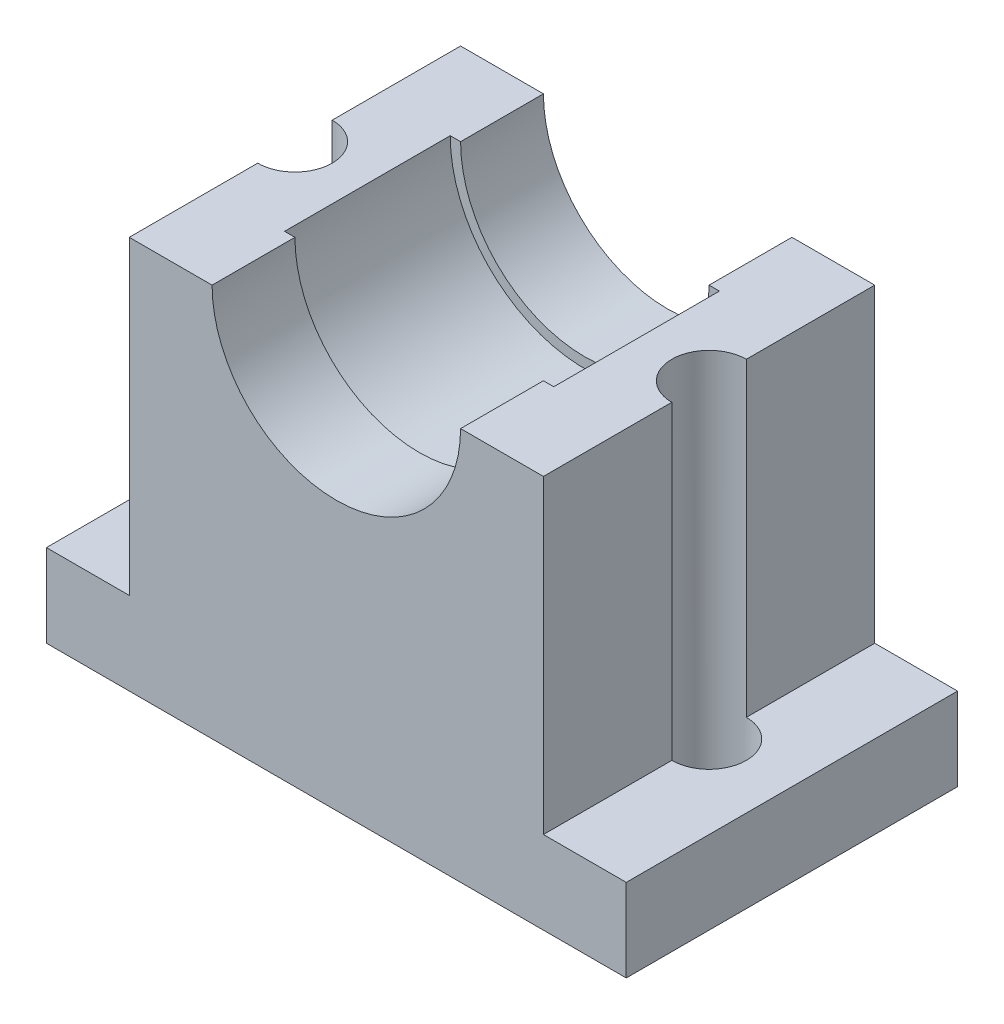
ISO-10303-21;
HEADER;
FILE_DESCRIPTION(('STEP AP214'),'2;1');
FILE_NAME('part.step','',(''),(''),'','','');
FILE_SCHEMA(('AUTOMOTIVE_DESIGN { 1 0 10303 214 1 1 1 1 }'));
ENDSEC;
DATA;
#1=APPLICATION_CONTEXT('core data for automotive mechanical design processes');
#2=APPLICATION_PROTOCOL_DEFINITION('international standard','automotive_design',2000,#1);
#3=PRODUCT_CONTEXT('',#1,'mechanical');
#4=PRODUCT('Part','Part','',(#3));
#5=PRODUCT_RELATED_PRODUCT_CATEGORY('part','',(#4));
#6=PRODUCT_DEFINITION_FORMATION('','',#4);
#7=PRODUCT_DEFINITION_CONTEXT('part definition',#1,'design');
#8=PRODUCT_DEFINITION('design','',#6,#7);
#9=PRODUCT_DEFINITION_SHAPE('','',#8);
#10=(LENGTH_UNIT() NAMED_UNIT(*) SI_UNIT(.MILLI.,.METRE.));
#11=(NAMED_UNIT(*) PLANE_ANGLE_UNIT() SI_UNIT($,.RADIAN.));
#12=(NAMED_UNIT(*) SI_UNIT($,.STERADIAN.) SOLID_ANGLE_UNIT());
#13=UNCERTAINTY_MEASURE_WITH_UNIT(LENGTH_MEASURE(1.E-05),#10,'distance_accuracy_value','');
#14=(GEOMETRIC_REPRESENTATION_CONTEXT(3) GLOBAL_UNCERTAINTY_ASSIGNED_CONTEXT((#13)) GLOBAL_UNIT_ASSIGNED_CONTEXT((#10,
#11,#12)) REPRESENTATION_CONTEXT('',''));
#15=CARTESIAN_POINT('',(0.,0.,0.));
#16=DIRECTION('',(0.,0.,1.));
#17=DIRECTION('',(1.,0.,0.));
#18=AXIS2_PLACEMENT_3D('',#15,#16,#17);
#19=CARTESIAN_POINT('',(-50.,20.,-40.));
#20=DIRECTION('',(-1.,0.,0.));
#21=DIRECTION('',(0.,0.,1.));
#22=AXIS2_PLACEMENT_3D('',#19,#20,#21);
#23=PLANE('',#22);
#24=DIRECTION('',(0.,0.,1.));
#25=VECTOR('',#24,1.);
#26=CARTESIAN_POINT('',(-50.,94.8836690389627,-40.));
#27=LINE('',#26,#25);
#28=CARTESIAN_POINT('',(-50.,94.8836690389627,9.));
#29=VERTEX_POINT('',#28);
#30=CARTESIAN_POINT('',(-50.,94.8836690389627,40.));
#31=VERTEX_POINT('',#30);
#32=EDGE_CURVE('E171',#29,#31,#27,.T.);
#33=ORIENTED_EDGE('',*,*,#32,.F.);
#34=DIRECTION('',(0.,1.,0.));
#35=VECTOR('',#34,1.);
#36=CARTESIAN_POINT('',(-50.,0.,8.99999999999999));
#37=LINE('',#36,#35);
#38=CARTESIAN_POINT('',(-50.,20.,9.));
#39=VERTEX_POINT('',#38);
#40=EDGE_CURVE('E11',#29,#39,#37,.F.);
#41=ORIENTED_EDGE('',*,*,#40,.T.);
#42=DIRECTION('',(0.,0.,1.));
#43=VECTOR('',#42,1.);
#44=CARTESIAN_POINT('',(-50.,20.,-40.));
#45=LINE('',#44,#43);
#46=CARTESIAN_POINT('',(-50.,20.,40.));
#47=VERTEX_POINT('',#46);
#48=EDGE_CURVE('E205',#39,#47,#45,.T.);
#49=ORIENTED_EDGE('',*,*,#48,.T.);
#50=DIRECTION('',(0.,-1.,0.));
#51=VECTOR('',#50,1.);
#52=CARTESIAN_POINT('',(-50.,20.,40.));
#53=LINE('',#52,#51);
#54=EDGE_CURVE('E178',#31,#47,#53,.T.);
#55=ORIENTED_EDGE('',*,*,#54,.F.);
#56=EDGE_LOOP('',(#33,#41,#49,#55));
#57=FACE_BOUND('',#56,.T.);
#58=ADVANCED_FACE('F39',(#57),#23,.T.);
#59=CARTESIAN_POINT('',(-50.,20.,-40.));
#60=VERTEX_POINT('',#59);
#61=CARTESIAN_POINT('',(-50.,20.,-9.00000000000001));
#62=VERTEX_POINT('',#61);
#63=EDGE_CURVE('E202',#60,#62,#45,.T.);
#64=ORIENTED_EDGE('',*,*,#63,.T.);
#65=DIRECTION('',(0.,1.,0.));
#66=VECTOR('',#65,1.);
#67=CARTESIAN_POINT('',(-50.,0.,-9.00000000000001));
#68=LINE('',#67,#66);
#69=CARTESIAN_POINT('',(-50.,94.8836690389627,-9.00000000000001));
#70=VERTEX_POINT('',#69);
#71=EDGE_CURVE('E47',#62,#70,#68,.T.);
#72=ORIENTED_EDGE('',*,*,#71,.T.);
#73=CARTESIAN_POINT('',(-50.,94.8836690389627,-40.));
#74=VERTEX_POINT('',#73);
#75=EDGE_CURVE('E174',#74,#70,#27,.T.);
#76=ORIENTED_EDGE('',*,*,#75,.F.);
#77=DIRECTION('',(0.,-1.,0.));
#78=VECTOR('',#77,1.);
#79=CARTESIAN_POINT('',(-50.,20.,-40.));
#80=LINE('',#79,#78);
#81=EDGE_CURVE('E289',#74,#60,#80,.T.);
#82=ORIENTED_EDGE('',*,*,#81,.T.);
#83=EDGE_LOOP('',(#64,#72,#76,#82));
#84=FACE_BOUND('',#83,.T.);
#85=ADVANCED_FACE('F252',(#84),#23,.T.);
#86=CARTESIAN_POINT('',(50.,20.,-40.));
#87=DIRECTION('',(1.,0.,0.));
#88=DIRECTION('',(0.,0.,-1.));
#89=AXIS2_PLACEMENT_3D('',#86,#87,#88);
#90=PLANE('',#89);
#91=DIRECTION('',(0.,1.,0.));
#92=VECTOR('',#91,1.);
#93=CARTESIAN_POINT('',(50.,0.,-9.00000000000001));
#94=LINE('',#93,#92);
#95=CARTESIAN_POINT('',(50.,20.,-9.00000000000001));
#96=VERTEX_POINT('',#95);
#97=CARTESIAN_POINT('',(50.,94.8836690389627,-9.00000000000001));
#98=VERTEX_POINT('',#97);
#99=EDGE_CURVE('E250',#96,#98,#94,.T.);
#100=ORIENTED_EDGE('',*,*,#99,.F.);
#101=DIRECTION('',(0.,0.,1.));
#102=VECTOR('',#101,1.);
#103=CARTESIAN_POINT('',(50.,20.,-40.));
#104=LINE('',#103,#102);
#105=CARTESIAN_POINT('',(50.,20.,-40.));
#106=VERTEX_POINT('',#105);
#107=EDGE_CURVE('E198',#106,#96,#104,.T.);
#108=ORIENTED_EDGE('',*,*,#107,.F.);
#109=DIRECTION('',(0.,1.,0.));
#110=VECTOR('',#109,1.);
#111=CARTESIAN_POINT('',(50.,20.,-40.));
#112=LINE('',#111,#110);
#113=CARTESIAN_POINT('',(50.,94.8836690389627,-40.));
#114=VERTEX_POINT('',#113);
#115=EDGE_CURVE('E291',#106,#114,#112,.T.);
#116=ORIENTED_EDGE('',*,*,#115,.T.);
#117=DIRECTION('',(0.,0.,1.));
#118=VECTOR('',#117,1.);
#119=CARTESIAN_POINT('',(50.,94.8836690389627,-40.));
#120=LINE('',#119,#118);
#121=EDGE_CURVE('E194',#114,#98,#120,.T.);
#122=ORIENTED_EDGE('',*,*,#121,.T.);
#123=EDGE_LOOP('',(#100,#108,#116,#122));
#124=FACE_BOUND('',#123,.T.);
#125=ADVANCED_FACE('F361',(#124),#90,.T.);
#126=CARTESIAN_POINT('',(-50.,94.8836690389627,-40.));
#127=DIRECTION('',(0.,1.,0.));
#128=DIRECTION('',(0.,0.,1.));
#129=AXIS2_PLACEMENT_3D('',#126,#127,#128);
#130=PLANE('',#129);
#131=ORIENTED_EDGE('',*,*,#75,.T.);
#132=CARTESIAN_POINT('',(-50.,94.8836690389627,0.));
#133=DIRECTION('',(0.,-1.,0.));
#134=DIRECTION('',(0.,0.,1.));
#135=AXIS2_PLACEMENT_3D('',#132,#133,#134);
#136=CIRCLE('',#135,9.);
#137=EDGE_CURVE('E54',#70,#29,#136,.T.);
#138=ORIENTED_EDGE('',*,*,#137,.T.);
#139=ORIENTED_EDGE('',*,*,#32,.T.);
#140=DIRECTION('',(-1.,0.,0.));
#141=VECTOR('',#140,1.);
#142=CARTESIAN_POINT('',(-50.,94.8836690389627,40.));
#143=LINE('',#142,#141);
#144=CARTESIAN_POINT('',(-30.,94.8836690389627,40.));
#145=VERTEX_POINT('',#144);
#146=EDGE_CURVE('E187',#145,#31,#143,.T.);
#147=ORIENTED_EDGE('',*,*,#146,.F.);
#148=DIRECTION('',(0.,0.,1.));
#149=VECTOR('',#148,1.);
#150=CARTESIAN_POINT('',(-30.,94.8836690389627,-40.));
#151=LINE('',#150,#149);
#152=CARTESIAN_POINT('',(-30.,94.8836690389627,20.));
#153=VERTEX_POINT('',#152);
#154=EDGE_CURVE('E184',#153,#145,#151,.T.);
#155=ORIENTED_EDGE('',*,*,#154,.F.);
#156=DIRECTION('',(-1.,0.,0.));
#157=VECTOR('',#156,1.);
#158=CARTESIAN_POINT('',(-50.,94.8836690389627,20.));
#159=LINE('',#158,#157);
#160=CARTESIAN_POINT('',(-32.5,94.8836690389627,20.));
#161=VERTEX_POINT('',#160);
#162=EDGE_CURVE('E280',#153,#161,#159,.T.);
#163=ORIENTED_EDGE('',*,*,#162,.T.);
#164=DIRECTION('',(0.,0.,1.));
#165=VECTOR('',#164,1.);
#166=CARTESIAN_POINT('',(-32.5,94.8836690389627,29.5759877610635));
#167=LINE('',#166,#165);
#168=CARTESIAN_POINT('',(-32.5,94.8836690389627,-20.));
#169=VERTEX_POINT('',#168);
#170=EDGE_CURVE('E283',#161,#169,#167,.F.);
#171=ORIENTED_EDGE('',*,*,#170,.T.);
#172=DIRECTION('',(1.,0.,0.));
#173=VECTOR('',#172,1.);
#174=CARTESIAN_POINT('',(-50.,94.8836690389627,-20.));
#175=LINE('',#174,#173);
#176=CARTESIAN_POINT('',(-30.,94.8836690389627,-20.));
#177=VERTEX_POINT('',#176);
#178=EDGE_CURVE('E286',#169,#177,#175,.T.);
#179=ORIENTED_EDGE('',*,*,#178,.T.);
#180=CARTESIAN_POINT('',(-30.,94.8836690389627,-40.));
#181=VERTEX_POINT('',#180);
#182=EDGE_CURVE('E180',#181,#177,#151,.T.);
#183=ORIENTED_EDGE('',*,*,#182,.F.);
#184=DIRECTION('',(-1.,0.,0.));
#185=VECTOR('',#184,1.);
#186=CARTESIAN_POINT('',(-50.,94.8836690389627,-40.));
#187=LINE('',#186,#185);
#188=EDGE_CURVE('E300',#181,#74,#187,.T.);
#189=ORIENTED_EDGE('',*,*,#188,.T.);
#190=EDGE_LOOP('',(#131,#138,#139,#147,#155,#163,#171,#179,#183,#189));
#191=FACE_BOUND('',#190,.T.);
#192=ADVANCED_FACE('F169',(#191),#130,.T.);
#193=CARTESIAN_POINT('',(0.,94.8836690389627,-40.));
#194=DIRECTION('',(0.,0.,1.));
#195=DIRECTION('',(1.,0.,0.));
#196=AXIS2_PLACEMENT_3D('',#193,#194,#195);
#197=CYLINDRICAL_SURFACE('',#196,30.);
#198=ORIENTED_EDGE('',*,*,#182,.T.);
#199=CARTESIAN_POINT('',(0.,94.8836690389627,-20.));
#200=DIRECTION('',(0.,0.,1.));
#201=DIRECTION('',(1.,0.,0.));
#202=AXIS2_PLACEMENT_3D('',#199,#200,#201);
#203=CIRCLE('',#202,30.);
#204=CARTESIAN_POINT('',(30.,94.8836690389627,-20.));
#205=VERTEX_POINT('',#204);
#206=EDGE_CURVE('E277',#177,#205,#203,.T.);
#207=ORIENTED_EDGE('',*,*,#206,.T.);
#208=DIRECTION('',(0.,0.,1.));
#209=VECTOR('',#208,1.);
#210=CARTESIAN_POINT('',(30.,94.8836690389627,-40.));
#211=LINE('',#210,#209);
#212=CARTESIAN_POINT('',(30.,94.8836690389627,-40.));
#213=VERTEX_POINT('',#212);
#214=EDGE_CURVE('E190',#213,#205,#211,.T.);
#215=ORIENTED_EDGE('',*,*,#214,.F.);
#216=CARTESIAN_POINT('',(0.,94.8836690389627,-40.));
#217=DIRECTION('',(0.,0.,-1.));
#218=DIRECTION('',(1.,0.,0.));
#219=AXIS2_PLACEMENT_3D('',#216,#217,#218);
#220=CIRCLE('',#219,30.);
#221=EDGE_CURVE('E297',#213,#181,#220,.T.);
#222=ORIENTED_EDGE('',*,*,#221,.T.);
#223=EDGE_LOOP('',(#198,#207,#215,#222));
#224=FACE_BOUND('',#223,.T.);
#225=ADVANCED_FACE('F331',(#224),#197,.F.);
#226=CARTESIAN_POINT('',(30.,94.8836690389627,20.));
#227=VERTEX_POINT('',#226);
#228=CARTESIAN_POINT('',(30.,94.8836690389627,40.));
#229=VERTEX_POINT('',#228);
#230=EDGE_CURVE('E193',#227,#229,#211,.T.);
#231=ORIENTED_EDGE('',*,*,#230,.F.);
#232=CARTESIAN_POINT('',(0.,94.8836690389627,20.));
#233=DIRECTION('',(0.,0.,1.));
#234=DIRECTION('',(1.,0.,0.));
#235=AXIS2_PLACEMENT_3D('',#232,#233,#234);
#236=CIRCLE('',#235,30.);
#237=EDGE_CURVE('E269',#153,#227,#236,.T.);
#238=ORIENTED_EDGE('',*,*,#237,.F.);
#239=ORIENTED_EDGE('',*,*,#154,.T.);
#240=CARTESIAN_POINT('',(0.,94.8836690389627,40.));
#241=DIRECTION('',(0.,0.,-1.));
#242=DIRECTION('',(1.,0.,0.));
#243=AXIS2_PLACEMENT_3D('',#240,#241,#242);
#244=CIRCLE('',#243,30.);
#245=EDGE_CURVE('E308',#229,#145,#244,.T.);
#246=ORIENTED_EDGE('',*,*,#245,.F.);
#247=EDGE_LOOP('',(#231,#238,#239,#246));
#248=FACE_BOUND('',#247,.T.);
#249=ADVANCED_FACE('F318',(#248),#197,.F.);
#250=CARTESIAN_POINT('',(30.,94.8836690389627,-40.));
#251=DIRECTION('',(0.,1.,0.));
#252=DIRECTION('',(0.,0.,1.));
#253=AXIS2_PLACEMENT_3D('',#250,#251,#252);
#254=PLANE('',#253);
#255=CARTESIAN_POINT('',(50.,94.8836690389627,0.));
#256=DIRECTION('',(0.,1.,0.));
#257=DIRECTION('',(0.,0.,1.));
#258=AXIS2_PLACEMENT_3D('',#255,#256,#257);
#259=CIRCLE('',#258,9.);
#260=CARTESIAN_POINT('',(50.,94.8836690389627,8.99999999999999));
#261=VERTEX_POINT('',#260);
#262=EDGE_CURVE('E62',#98,#261,#259,.T.);
#263=ORIENTED_EDGE('',*,*,#262,.F.);
#264=ORIENTED_EDGE('',*,*,#121,.F.);
#265=DIRECTION('',(-1.,0.,0.));
#266=VECTOR('',#265,1.);
#267=CARTESIAN_POINT('',(30.,94.8836690389627,-40.));
#268=LINE('',#267,#266);
#269=EDGE_CURVE('E294',#114,#213,#268,.T.);
#270=ORIENTED_EDGE('',*,*,#269,.T.);
#271=ORIENTED_EDGE('',*,*,#214,.T.);
#272=DIRECTION('',(1.,0.,0.));
#273=VECTOR('',#272,1.);
#274=CARTESIAN_POINT('',(30.,94.8836690389627,-20.));
#275=LINE('',#274,#273);
#276=CARTESIAN_POINT('',(32.5,94.8836690389627,-20.));
#277=VERTEX_POINT('',#276);
#278=EDGE_CURVE('E245',#205,#277,#275,.T.);
#279=ORIENTED_EDGE('',*,*,#278,.T.);
#280=DIRECTION('',(0.,0.,1.));
#281=VECTOR('',#280,1.);
#282=CARTESIAN_POINT('',(32.5,94.8836690389627,29.5759877610635));
#283=LINE('',#282,#281);
#284=CARTESIAN_POINT('',(32.5,94.8836690389627,20.));
#285=VERTEX_POINT('',#284);
#286=EDGE_CURVE('E242',#277,#285,#283,.T.);
#287=ORIENTED_EDGE('',*,*,#286,.T.);
#288=DIRECTION('',(-1.,0.,0.));
#289=VECTOR('',#288,1.);
#290=CARTESIAN_POINT('',(30.,94.8836690389627,20.));
#291=LINE('',#290,#289);
#292=EDGE_CURVE('E239',#285,#227,#291,.T.);
#293=ORIENTED_EDGE('',*,*,#292,.T.);
#294=ORIENTED_EDGE('',*,*,#230,.T.);
#295=DIRECTION('',(-1.,0.,0.));
#296=VECTOR('',#295,1.);
#297=CARTESIAN_POINT('',(30.,94.8836690389627,40.));
#298=LINE('',#297,#296);
#299=CARTESIAN_POINT('',(50.,94.8836690389627,40.));
#300=VERTEX_POINT('',#299);
#301=EDGE_CURVE('E306',#300,#229,#298,.T.);
#302=ORIENTED_EDGE('',*,*,#301,.F.);
#303=EDGE_CURVE('E197',#261,#300,#120,.T.);
#304=ORIENTED_EDGE('',*,*,#303,.F.);
#305=EDGE_LOOP('',(#263,#264,#270,#271,#279,#287,#293,#294,#302,#304));
#306=FACE_BOUND('',#305,.T.);
#307=ADVANCED_FACE('F323',(#306),#254,.T.);
#308=CARTESIAN_POINT('',(0.,20.,0.));
#309=DIRECTION('',(0.,-1.,0.));
#310=DIRECTION('',(0.,0.,-1.));
#311=AXIS2_PLACEMENT_3D('',#308,#309,#310);
#312=PLANE('',#311);
#313=CARTESIAN_POINT('',(-50.,20.,0.));
#314=DIRECTION('',(0.,-1.,0.));
#315=DIRECTION('',(0.,0.,-1.));
#316=AXIS2_PLACEMENT_3D('',#313,#314,#315);
#317=CIRCLE('',#316,9.);
#318=EDGE_CURVE('E163',#62,#39,#317,.F.);
#319=ORIENTED_EDGE('',*,*,#318,.F.);
#320=ORIENTED_EDGE('',*,*,#63,.F.);
#321=DIRECTION('',(-1.,0.,0.));
#322=VECTOR('',#321,1.);
#323=CARTESIAN_POINT('',(-70.,20.,-40.));
#324=LINE('',#323,#322);
#325=CARTESIAN_POINT('',(-70.,20.,-40.));
#326=VERTEX_POINT('',#325);
#327=EDGE_CURVE('E209',#60,#326,#324,.T.);
#328=ORIENTED_EDGE('',*,*,#327,.T.);
#329=DIRECTION('',(0.,0.,1.));
#330=VECTOR('',#329,1.);
#331=CARTESIAN_POINT('',(-70.,20.,40.));
#332=LINE('',#331,#330);
#333=CARTESIAN_POINT('',(-70.,20.,40.));
#334=VERTEX_POINT('',#333);
#335=EDGE_CURVE('E214',#326,#334,#332,.T.);
#336=ORIENTED_EDGE('',*,*,#335,.T.);
#337=DIRECTION('',(1.,0.,0.));
#338=VECTOR('',#337,1.);
#339=CARTESIAN_POINT('',(-70.,20.,40.));
#340=LINE('',#339,#338);
#341=EDGE_CURVE('E217',#334,#47,#340,.T.);
#342=ORIENTED_EDGE('',*,*,#341,.T.);
#343=ORIENTED_EDGE('',*,*,#48,.F.);
#344=EDGE_LOOP('',(#319,#320,#328,#336,#342,#343));
#345=FACE_BOUND('',#344,.T.);
#346=ADVANCED_FACE('F256',(#345),#312,.F.);
#347=CARTESIAN_POINT('',(70.,20.,40.));
#348=DIRECTION('',(-1.,0.,0.));
#349=DIRECTION('',(0.,0.,1.));
#350=AXIS2_PLACEMENT_3D('',#347,#348,#349);
#351=PLANE('',#350);
#352=DIRECTION('',(0.,0.,-1.));
#353=VECTOR('',#352,1.);
#354=CARTESIAN_POINT('',(70.,0.,40.));
#355=LINE('',#354,#353);
#356=CARTESIAN_POINT('',(70.,0.,40.));
#357=VERTEX_POINT('',#356);
#358=CARTESIAN_POINT('',(70.,0.,-40.));
#359=VERTEX_POINT('',#358);
#360=EDGE_CURVE('E182',#357,#359,#355,.T.);
#361=ORIENTED_EDGE('',*,*,#360,.T.);
#362=DIRECTION('',(0.,-1.,0.));
#363=VECTOR('',#362,1.);
#364=CARTESIAN_POINT('',(70.,20.,-40.));
#365=LINE('',#364,#363);
#366=CARTESIAN_POINT('',(70.,20.,-40.));
#367=VERTEX_POINT('',#366);
#368=EDGE_CURVE('E236',#367,#359,#365,.T.);
#369=ORIENTED_EDGE('',*,*,#368,.F.);
#370=DIRECTION('',(0.,0.,-1.));
#371=VECTOR('',#370,1.);
#372=CARTESIAN_POINT('',(70.,20.,40.));
#373=LINE('',#372,#371);
#374=CARTESIAN_POINT('',(70.,20.,40.));
#375=VERTEX_POINT('',#374);
#376=EDGE_CURVE('E206',#375,#367,#373,.T.);
#377=ORIENTED_EDGE('',*,*,#376,.F.);
#378=DIRECTION('',(0.,-1.,0.));
#379=VECTOR('',#378,1.);
#380=CARTESIAN_POINT('',(70.,20.,40.));
#381=LINE('',#380,#379);
#382=EDGE_CURVE('E220',#375,#357,#381,.T.);
#383=ORIENTED_EDGE('',*,*,#382,.T.);
#384=EDGE_LOOP('',(#361,#369,#377,#383));
#385=FACE_BOUND('',#384,.T.);
#386=ADVANCED_FACE('F41',(#385),#351,.F.);
#387=CARTESIAN_POINT('',(-70.,20.,-40.));
#388=DIRECTION('',(0.,0.,1.));
#389=DIRECTION('',(1.,0.,0.));
#390=AXIS2_PLACEMENT_3D('',#387,#388,#389);
#391=PLANE('',#390);
#392=DIRECTION('',(-1.,0.,0.));
#393=VECTOR('',#392,1.);
#394=CARTESIAN_POINT('',(-70.,0.,-40.));
#395=LINE('',#394,#393);
#396=CARTESIAN_POINT('',(-70.,0.,-40.));
#397=VERTEX_POINT('',#396);
#398=EDGE_CURVE('E223',#359,#397,#395,.T.);
#399=ORIENTED_EDGE('',*,*,#398,.T.);
#400=DIRECTION('',(0.,-1.,0.));
#401=VECTOR('',#400,1.);
#402=CARTESIAN_POINT('',(-70.,20.,-40.));
#403=LINE('',#402,#401);
#404=EDGE_CURVE('E233',#326,#397,#403,.T.);
#405=ORIENTED_EDGE('',*,*,#404,.F.);
#406=ORIENTED_EDGE('',*,*,#327,.F.);
#407=ORIENTED_EDGE('',*,*,#81,.F.);
#408=ORIENTED_EDGE('',*,*,#188,.F.);
#409=ORIENTED_EDGE('',*,*,#221,.F.);
#410=ORIENTED_EDGE('',*,*,#269,.F.);
#411=ORIENTED_EDGE('',*,*,#115,.F.);
#412=EDGE_CURVE('E211',#367,#106,#324,.T.);
#413=ORIENTED_EDGE('',*,*,#412,.F.);
#414=ORIENTED_EDGE('',*,*,#368,.T.);
#415=EDGE_LOOP('',(#399,#405,#406,#407,#408,#409,#410,#411,#413,#414));
#416=FACE_BOUND('',#415,.T.);
#417=ADVANCED_FACE('F336',(#416),#391,.F.);
#418=CARTESIAN_POINT('',(-70.,20.,40.));
#419=DIRECTION('',(1.,0.,0.));
#420=DIRECTION('',(0.,0.,-1.));
#421=AXIS2_PLACEMENT_3D('',#418,#419,#420);
#422=PLANE('',#421);
#423=DIRECTION('',(0.,0.,1.));
#424=VECTOR('',#423,1.);
#425=CARTESIAN_POINT('',(-70.,0.,40.));
#426=LINE('',#425,#424);
#427=CARTESIAN_POINT('',(-70.,0.,40.));
#428=VERTEX_POINT('',#427);
#429=EDGE_CURVE('E225',#397,#428,#426,.T.);
#430=ORIENTED_EDGE('',*,*,#429,.T.);
#431=DIRECTION('',(0.,-1.,0.));
#432=VECTOR('',#431,1.);
#433=CARTESIAN_POINT('',(-70.,20.,40.));
#434=LINE('',#433,#432);
#435=EDGE_CURVE('E230',#334,#428,#434,.T.);
#436=ORIENTED_EDGE('',*,*,#435,.F.);
#437=ORIENTED_EDGE('',*,*,#335,.F.);
#438=ORIENTED_EDGE('',*,*,#404,.T.);
#439=EDGE_LOOP('',(#430,#436,#437,#438));
#440=FACE_BOUND('',#439,.T.);
#441=ADVANCED_FACE('F341',(#440),#422,.F.);
#442=CARTESIAN_POINT('',(-70.,20.,40.));
#443=DIRECTION('',(0.,0.,-1.));
#444=DIRECTION('',(-1.,0.,0.));
#445=AXIS2_PLACEMENT_3D('',#442,#443,#444);
#446=PLANE('',#445);
#447=DIRECTION('',(1.,0.,0.));
#448=VECTOR('',#447,1.);
#449=CARTESIAN_POINT('',(-70.,0.,40.));
#450=LINE('',#449,#448);
#451=EDGE_CURVE('E210',#428,#357,#450,.T.);
#452=ORIENTED_EDGE('',*,*,#451,.T.);
#453=ORIENTED_EDGE('',*,*,#382,.F.);
#454=CARTESIAN_POINT('',(50.,20.,40.));
#455=VERTEX_POINT('',#454);
#456=EDGE_CURVE('E216',#455,#375,#340,.T.);
#457=ORIENTED_EDGE('',*,*,#456,.F.);
#458=DIRECTION('',(0.,1.,0.));
#459=VECTOR('',#458,1.);
#460=CARTESIAN_POINT('',(50.,20.,40.));
#461=LINE('',#460,#459);
#462=EDGE_CURVE('E303',#455,#300,#461,.T.);
#463=ORIENTED_EDGE('',*,*,#462,.T.);
#464=ORIENTED_EDGE('',*,*,#301,.T.);
#465=ORIENTED_EDGE('',*,*,#245,.T.);
#466=ORIENTED_EDGE('',*,*,#146,.T.);
#467=ORIENTED_EDGE('',*,*,#54,.T.);
#468=ORIENTED_EDGE('',*,*,#341,.F.);
#469=ORIENTED_EDGE('',*,*,#435,.T.);
#470=EDGE_LOOP('',(#452,#453,#457,#463,#464,#465,#466,#467,#468,#469));
#471=FACE_BOUND('',#470,.T.);
#472=ADVANCED_FACE('F312',(#471),#446,.F.);
#473=ORIENTED_EDGE('',*,*,#107,.T.);
#474=CARTESIAN_POINT('',(50.,20.,0.));
#475=DIRECTION('',(0.,-1.,0.));
#476=DIRECTION('',(0.,0.,-1.));
#477=AXIS2_PLACEMENT_3D('',#474,#475,#476);
#478=CIRCLE('',#477,9.);
#479=CARTESIAN_POINT('',(50.,20.,8.99999999999999));
#480=VERTEX_POINT('',#479);
#481=EDGE_CURVE('E265',#96,#480,#478,.T.);
#482=ORIENTED_EDGE('',*,*,#481,.T.);
#483=EDGE_CURVE('E201',#480,#455,#104,.T.);
#484=ORIENTED_EDGE('',*,*,#483,.T.);
#485=ORIENTED_EDGE('',*,*,#456,.T.);
#486=ORIENTED_EDGE('',*,*,#376,.T.);
#487=ORIENTED_EDGE('',*,*,#412,.T.);
#488=EDGE_LOOP('',(#473,#482,#484,#485,#486,#487));
#489=FACE_BOUND('',#488,.T.);
#490=ADVANCED_FACE('F354',(#489),#312,.F.);
#491=CARTESIAN_POINT('',(0.,0.,0.));
#492=DIRECTION('',(0.,-1.,0.));
#493=DIRECTION('',(0.,0.,-1.));
#494=AXIS2_PLACEMENT_3D('',#491,#492,#493);
#495=PLANE('',#494);
#496=CARTESIAN_POINT('',(-50.,0.,0.));
#497=DIRECTION('',(0.,-1.,0.));
#498=DIRECTION('',(0.,0.,1.));
#499=AXIS2_PLACEMENT_3D('',#496,#497,#498);
#500=CIRCLE('',#499,9.);
#501=CARTESIAN_POINT('',(-50.,0.,9.));
#502=VERTEX_POINT('',#501);
#503=EDGE_CURVE('E175',#502,#502,#500,.T.);
#504=ORIENTED_EDGE('',*,*,#503,.F.);
#505=EDGE_LOOP('',(#504));
#506=FACE_BOUND('',#505,.T.);
#507=CARTESIAN_POINT('',(50.,0.,0.));
#508=DIRECTION('',(0.,1.,0.));
#509=DIRECTION('',(0.,0.,1.));
#510=AXIS2_PLACEMENT_3D('',#507,#508,#509);
#511=CIRCLE('',#510,9.);
#512=CARTESIAN_POINT('',(50.,0.,9.));
#513=VERTEX_POINT('',#512);
#514=EDGE_CURVE('E259',#513,#513,#511,.T.);
#515=ORIENTED_EDGE('',*,*,#514,.T.);
#516=EDGE_LOOP('',(#515));
#517=FACE_BOUND('',#516,.T.);
#518=ORIENTED_EDGE('',*,*,#360,.F.);
#519=ORIENTED_EDGE('',*,*,#451,.F.);
#520=ORIENTED_EDGE('',*,*,#429,.F.);
#521=ORIENTED_EDGE('',*,*,#398,.F.);
#522=EDGE_LOOP('',(#518,#519,#520,#521));
#523=FACE_BOUND('',#522,.T.);
#524=ADVANCED_FACE('F347',(#506,#517,#523),#495,.T.);
#525=DIRECTION('',(0.,1.,0.));
#526=VECTOR('',#525,1.);
#527=CARTESIAN_POINT('',(50.,0.,8.99999999999999));
#528=LINE('',#527,#526);
#529=EDGE_CURVE('E248',#261,#480,#528,.F.);
#530=ORIENTED_EDGE('',*,*,#529,.F.);
#531=ORIENTED_EDGE('',*,*,#303,.T.);
#532=ORIENTED_EDGE('',*,*,#462,.F.);
#533=ORIENTED_EDGE('',*,*,#483,.F.);
#534=EDGE_LOOP('',(#530,#531,#532,#533));
#535=FACE_BOUND('',#534,.T.);
#536=ADVANCED_FACE('F357',(#535),#90,.T.);
#537=CARTESIAN_POINT('',(-30.,94.8836690389627,-20.));
#538=DIRECTION('',(0.,0.,1.));
#539=DIRECTION('',(1.,0.,0.));
#540=AXIS2_PLACEMENT_3D('',#537,#538,#539);
#541=PLANE('',#540);
#542=CARTESIAN_POINT('',(0.,94.8836690389627,-20.));
#543=DIRECTION('',(0.,0.,1.));
#544=DIRECTION('',(1.,0.,0.));
#545=AXIS2_PLACEMENT_3D('',#542,#543,#544);
#546=CIRCLE('',#545,32.5);
#547=EDGE_CURVE('E274',#169,#277,#546,.T.);
#548=ORIENTED_EDGE('',*,*,#547,.T.);
#549=ORIENTED_EDGE('',*,*,#278,.F.);
#550=ORIENTED_EDGE('',*,*,#206,.F.);
#551=ORIENTED_EDGE('',*,*,#178,.F.);
#552=EDGE_LOOP('',(#548,#549,#550,#551));
#553=FACE_BOUND('',#552,.T.);
#554=ADVANCED_FACE('F329',(#553),#541,.T.);
#555=CARTESIAN_POINT('',(0.,94.8836690389627,29.5759877610635));
#556=DIRECTION('',(0.,0.,1.));
#557=DIRECTION('',(1.,0.,0.));
#558=AXIS2_PLACEMENT_3D('',#555,#556,#557);
#559=CYLINDRICAL_SURFACE('',#558,32.5);
#560=CARTESIAN_POINT('',(0.,94.8836690389627,20.));
#561=DIRECTION('',(0.,0.,1.));
#562=DIRECTION('',(1.,0.,0.));
#563=AXIS2_PLACEMENT_3D('',#560,#561,#562);
#564=CIRCLE('',#563,32.5);
#565=EDGE_CURVE('E271',#161,#285,#564,.T.);
#566=ORIENTED_EDGE('',*,*,#565,.T.);
#567=ORIENTED_EDGE('',*,*,#286,.F.);
#568=ORIENTED_EDGE('',*,*,#547,.F.);
#569=ORIENTED_EDGE('',*,*,#170,.F.);
#570=EDGE_LOOP('',(#566,#567,#568,#569));
#571=FACE_BOUND('',#570,.T.);
#572=ADVANCED_FACE('F327',(#571),#559,.F.);
#573=CARTESIAN_POINT('',(-30.,94.8836690389627,20.));
#574=DIRECTION('',(0.,0.,-1.));
#575=DIRECTION('',(-1.,0.,0.));
#576=AXIS2_PLACEMENT_3D('',#573,#574,#575);
#577=PLANE('',#576);
#578=ORIENTED_EDGE('',*,*,#237,.T.);
#579=ORIENTED_EDGE('',*,*,#292,.F.);
#580=ORIENTED_EDGE('',*,*,#565,.F.);
#581=ORIENTED_EDGE('',*,*,#162,.F.);
#582=EDGE_LOOP('',(#578,#579,#580,#581));
#583=FACE_BOUND('',#582,.T.);
#584=ADVANCED_FACE('F320',(#583),#577,.T.);
#585=CARTESIAN_POINT('',(50.,0.,0.));
#586=DIRECTION('',(0.,1.,0.));
#587=DIRECTION('',(0.,0.,1.));
#588=AXIS2_PLACEMENT_3D('',#585,#586,#587);
#589=CYLINDRICAL_SURFACE('',#588,9.);
#590=ORIENTED_EDGE('',*,*,#99,.T.);
#591=ORIENTED_EDGE('',*,*,#262,.T.);
#592=ORIENTED_EDGE('',*,*,#529,.T.);
#593=ORIENTED_EDGE('',*,*,#481,.F.);
#594=EDGE_LOOP('',(#590,#591,#592,#593));
#595=FACE_BOUND('',#594,.T.);
#596=ORIENTED_EDGE('',*,*,#514,.F.);
#597=EDGE_LOOP('',(#596));
#598=FACE_BOUND('',#597,.T.);
#599=ADVANCED_FACE('F363',(#595,#598),#589,.F.);
#600=CARTESIAN_POINT('',(-50.,0.,0.));
#601=DIRECTION('',(0.,1.,0.));
#602=DIRECTION('',(0.,0.,1.));
#603=AXIS2_PLACEMENT_3D('',#600,#601,#602);
#604=CYLINDRICAL_SURFACE('',#603,9.);
#605=ORIENTED_EDGE('',*,*,#503,.T.);
#606=EDGE_LOOP('',(#605));
#607=FACE_BOUND('',#606,.T.);
#608=ORIENTED_EDGE('',*,*,#137,.F.);
#609=ORIENTED_EDGE('',*,*,#71,.F.);
#610=ORIENTED_EDGE('',*,*,#318,.T.);
#611=ORIENTED_EDGE('',*,*,#40,.F.);
#612=EDGE_LOOP('',(#608,#609,#610,#611));
#613=FACE_BOUND('',#612,.T.);
#614=ADVANCED_FACE('F161',(#607,#613),#604,.F.);
#615=CLOSED_SHELL('',(#58,#85,#125,#192,#225,#249,#307,#346,#386,#417,#441,#472,#490,#524,#536,
#554,#572,#584,#599,#614));
#616=MANIFOLD_SOLID_BREP('B2',#615);
#617=ADVANCED_BREP_SHAPE_REPRESENTATION('',(#18,#616),#14);
#618=SHAPE_DEFINITION_REPRESENTATION(#9,#617);
ENDSEC;
END-ISO-10303-21;
